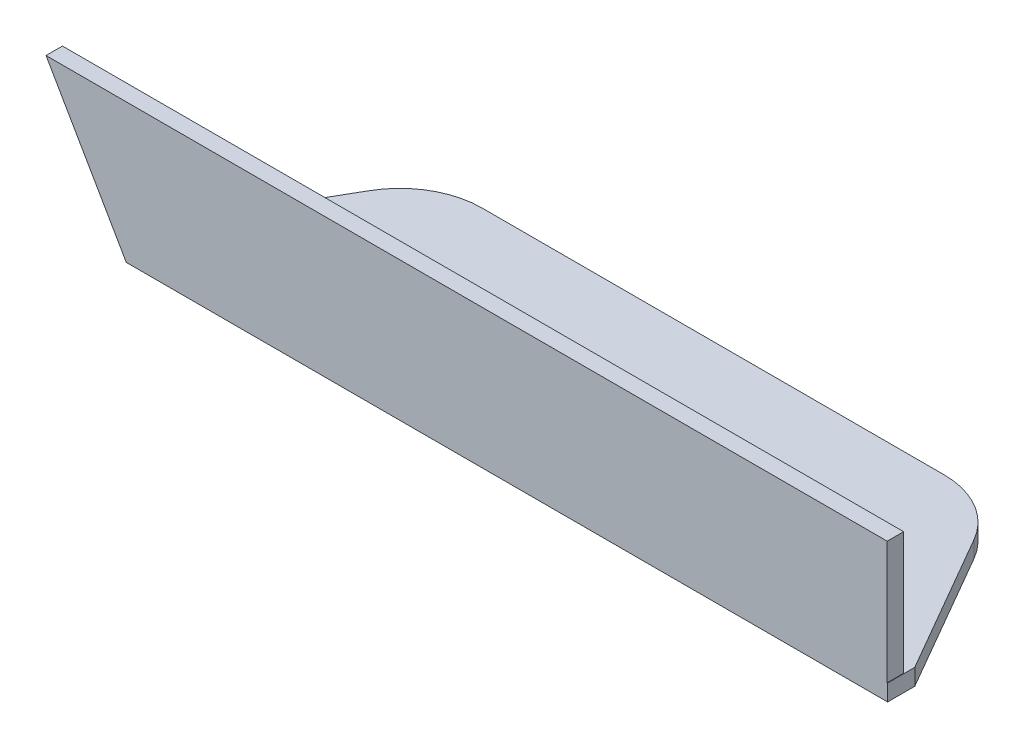
ISO-10303-21;
HEADER;
FILE_DESCRIPTION(('STEP AP214'),'2;1');
FILE_NAME('part.step','',(''),(''),'','','');
FILE_SCHEMA(('AUTOMOTIVE_DESIGN { 1 0 10303 214 1 1 1 1 }'));
ENDSEC;
DATA;
#1=APPLICATION_CONTEXT('core data for automotive mechanical design processes');
#2=APPLICATION_PROTOCOL_DEFINITION('international standard','automotive_design',2000,#1);
#3=PRODUCT_CONTEXT('',#1,'mechanical');
#4=PRODUCT('Part','Part','',(#3));
#5=PRODUCT_RELATED_PRODUCT_CATEGORY('part','',(#4));
#6=PRODUCT_DEFINITION_FORMATION('','',#4);
#7=PRODUCT_DEFINITION_CONTEXT('part definition',#1,'design');
#8=PRODUCT_DEFINITION('design','',#6,#7);
#9=PRODUCT_DEFINITION_SHAPE('','',#8);
#10=(LENGTH_UNIT() NAMED_UNIT(*) SI_UNIT(.MILLI.,.METRE.));
#11=(NAMED_UNIT(*) PLANE_ANGLE_UNIT() SI_UNIT($,.RADIAN.));
#12=(NAMED_UNIT(*) SI_UNIT($,.STERADIAN.) SOLID_ANGLE_UNIT());
#13=UNCERTAINTY_MEASURE_WITH_UNIT(LENGTH_MEASURE(1.E-05),#10,'distance_accuracy_value','');
#14=(GEOMETRIC_REPRESENTATION_CONTEXT(3) GLOBAL_UNCERTAINTY_ASSIGNED_CONTEXT((#13)) GLOBAL_UNIT_ASSIGNED_CONTEXT((#10,
#11,#12)) REPRESENTATION_CONTEXT('',''));
#15=CARTESIAN_POINT('',(0.,0.,0.));
#16=DIRECTION('',(0.,0.,1.));
#17=DIRECTION('',(1.,0.,0.));
#18=AXIS2_PLACEMENT_3D('',#15,#16,#17);
#19=CARTESIAN_POINT('',(-0.403411844343601,23.5,-50.));
#20=DIRECTION('',(0.,0.,1.));
#21=DIRECTION('',(1.,0.,0.));
#22=AXIS2_PLACEMENT_3D('',#19,#20,#21);
#23=PLANE('',#22);
#24=DIRECTION('',(0.,-1.,0.));
#25=VECTOR('',#24,1.);
#26=CARTESIAN_POINT('',(70.,25.,-50.));
#27=LINE('',#26,#25);
#28=CARTESIAN_POINT('',(70.,25.,-50.));
#29=VERTEX_POINT('',#28);
#30=CARTESIAN_POINT('',(70.,22.,-50.));
#31=VERTEX_POINT('',#30);
#32=EDGE_CURVE('E11',#29,#31,#27,.T.);
#33=ORIENTED_EDGE('',*,*,#32,.F.);
#34=DIRECTION('',(-1.,0.,0.));
#35=VECTOR('',#34,1.);
#36=CARTESIAN_POINT('',(70.,25.,-50.));
#37=LINE('',#36,#35);
#38=CARTESIAN_POINT('',(69.9238420958906,25.,-50.));
#39=VERTEX_POINT('',#38);
#40=EDGE_CURVE('E196',#29,#39,#37,.T.);
#41=ORIENTED_EDGE('',*,*,#40,.T.);
#42=DIRECTION('',(0.,1.,0.));
#43=VECTOR('',#42,1.);
#44=CARTESIAN_POINT('',(69.9238420958906,25.,-50.));
#45=LINE('',#44,#43);
#46=CARTESIAN_POINT('',(69.9238420958906,47.4,-50.));
#47=VERTEX_POINT('',#46);
#48=EDGE_CURVE('E241',#39,#47,#45,.T.);
#49=ORIENTED_EDGE('',*,*,#48,.T.);
#50=DIRECTION('',(-1.,0.,0.));
#51=VECTOR('',#50,1.);
#52=CARTESIAN_POINT('',(-70.8068236886871,47.4,-50.));
#53=LINE('',#52,#51);
#54=CARTESIAN_POINT('',(-83.7394697185345,47.4,-50.));
#55=VERTEX_POINT('',#54);
#56=EDGE_CURVE('E206',#47,#55,#53,.T.);
#57=ORIENTED_EDGE('',*,*,#56,.T.);
#58=DIRECTION('',(-0.499999999999993,0.866025403784443,0.));
#59=VECTOR('',#58,1.);
#60=CARTESIAN_POINT('',(-83.7394697185345,47.4,-50.));
#61=LINE('',#60,#59);
#62=CARTESIAN_POINT('',(-69.0747728811182,22.,-50.));
#63=VERTEX_POINT('',#62);
#64=EDGE_CURVE('E170',#63,#55,#61,.T.);
#65=ORIENTED_EDGE('',*,*,#64,.F.);
#66=DIRECTION('',(-1.,0.,0.));
#67=VECTOR('',#66,1.);
#68=CARTESIAN_POINT('',(70.,22.,-50.));
#69=LINE('',#68,#67);
#70=EDGE_CURVE('E58',#31,#63,#69,.T.);
#71=ORIENTED_EDGE('',*,*,#70,.F.);
#72=EDGE_LOOP('',(#33,#41,#49,#57,#65,#71));
#73=FACE_BOUND('',#72,.T.);
#74=ADVANCED_FACE('F47',(#73),#23,.T.);
#75=CARTESIAN_POINT('',(-0.403411844343601,23.5,-88.1));
#76=DIRECTION('',(0.,0.,1.));
#77=DIRECTION('',(1.,0.,0.));
#78=AXIS2_PLACEMENT_3D('',#75,#76,#77);
#79=PLANE('',#78);
#80=DIRECTION('',(0.,1.,0.));
#81=VECTOR('',#80,1.);
#82=CARTESIAN_POINT('',(-42.2043046777616,25.,-88.1));
#83=LINE('',#82,#81);
#84=CARTESIAN_POINT('',(-42.2043046777616,22.,-88.1));
#85=VERTEX_POINT('',#84);
#86=CARTESIAN_POINT('',(-42.2043046777616,25.,-88.1));
#87=VERTEX_POINT('',#86);
#88=EDGE_CURVE('E234',#85,#87,#83,.T.);
#89=ORIENTED_EDGE('',*,*,#88,.T.);
#90=DIRECTION('',(-1.,0.,0.));
#91=VECTOR('',#90,1.);
#92=CARTESIAN_POINT('',(70.,25.,-88.1));
#93=LINE('',#92,#91);
#94=CARTESIAN_POINT('',(42.2043046777617,25.,-88.1));
#95=VERTEX_POINT('',#94);
#96=EDGE_CURVE('E216',#95,#87,#93,.T.);
#97=ORIENTED_EDGE('',*,*,#96,.F.);
#98=DIRECTION('',(0.,1.,0.));
#99=VECTOR('',#98,1.);
#100=CARTESIAN_POINT('',(42.2043046777616,25.,-88.1));
#101=LINE('',#100,#99);
#102=CARTESIAN_POINT('',(42.2043046777617,22.,-88.1));
#103=VERTEX_POINT('',#102);
#104=EDGE_CURVE('E226',#103,#95,#101,.T.);
#105=ORIENTED_EDGE('',*,*,#104,.F.);
#106=DIRECTION('',(1.,0.,0.));
#107=VECTOR('',#106,1.);
#108=CARTESIAN_POINT('',(70.,22.,-88.1));
#109=LINE('',#108,#107);
#110=EDGE_CURVE('E209',#85,#103,#109,.T.);
#111=ORIENTED_EDGE('',*,*,#110,.F.);
#112=EDGE_LOOP('',(#89,#97,#105,#111));
#113=FACE_BOUND('',#112,.T.);
#114=ADVANCED_FACE('F312',(#113),#79,.F.);
#115=CARTESIAN_POINT('',(70.,22.,-50.));
#116=DIRECTION('',(-1.,0.,0.));
#117=DIRECTION('',(0.,0.,1.));
#118=AXIS2_PLACEMENT_3D('',#115,#116,#117);
#119=PLANE('',#118);
#120=DIRECTION('',(0.,1.,0.));
#121=VECTOR('',#120,1.);
#122=CARTESIAN_POINT('',(70.,23.5,-54.9564434701788));
#123=LINE('',#122,#121);
#124=CARTESIAN_POINT('',(70.,22.,-54.9564434701788));
#125=VERTEX_POINT('',#124);
#126=CARTESIAN_POINT('',(70.,25.,-54.9564434701788));
#127=VERTEX_POINT('',#126);
#128=EDGE_CURVE('E201',#125,#127,#123,.T.);
#129=ORIENTED_EDGE('',*,*,#128,.T.);
#130=DIRECTION('',(0.,0.,-1.));
#131=VECTOR('',#130,1.);
#132=CARTESIAN_POINT('',(70.,25.,-50.));
#133=LINE('',#132,#131);
#134=EDGE_CURVE('E219',#29,#127,#133,.T.);
#135=ORIENTED_EDGE('',*,*,#134,.F.);
#136=ORIENTED_EDGE('',*,*,#32,.T.);
#137=DIRECTION('',(0.,0.,-1.));
#138=VECTOR('',#137,1.);
#139=CARTESIAN_POINT('',(70.,22.,-50.));
#140=LINE('',#139,#138);
#141=EDGE_CURVE('E230',#31,#125,#140,.T.);
#142=ORIENTED_EDGE('',*,*,#141,.T.);
#143=EDGE_LOOP('',(#129,#135,#136,#142));
#144=FACE_BOUND('',#143,.T.);
#145=ADVANCED_FACE('F282',(#144),#119,.F.);
#146=CARTESIAN_POINT('',(-69.0747728811182,22.,-50.));
#147=DIRECTION('',(0.,1.,0.));
#148=DIRECTION('',(1.,0.,0.));
#149=AXIS2_PLACEMENT_3D('',#146,#147,#148);
#150=PLANE('',#149);
#151=CARTESIAN_POINT('',(-42.2043046777616,22.,-73.1));
#152=DIRECTION('',(0.,-1.,0.));
#153=DIRECTION('',(0.,0.,-1.));
#154=AXIS2_PLACEMENT_3D('',#151,#152,#153);
#155=CIRCLE('',#154,15.);
#156=CARTESIAN_POINT('',(-55.1946857345283,22.,-80.6));
#157=VERTEX_POINT('',#156);
#158=EDGE_CURVE('E238',#157,#85,#155,.T.);
#159=ORIENTED_EDGE('',*,*,#158,.T.);
#160=ORIENTED_EDGE('',*,*,#110,.T.);
#161=CARTESIAN_POINT('',(42.2043046777616,22.,-73.1));
#162=DIRECTION('',(0.,-1.,0.));
#163=DIRECTION('',(0.866025403784438,0.,-0.5));
#164=AXIS2_PLACEMENT_3D('',#161,#162,#163);
#165=CIRCLE('',#164,15.);
#166=CARTESIAN_POINT('',(55.1946857345283,22.,-80.6));
#167=VERTEX_POINT('',#166);
#168=EDGE_CURVE('E222',#103,#167,#165,.T.);
#169=ORIENTED_EDGE('',*,*,#168,.T.);
#170=DIRECTION('',(0.5,0.,0.866025403784439));
#171=VECTOR('',#170,1.);
#172=CARTESIAN_POINT('',(53.6887548792593,22.,-83.2083487540117));
#173=LINE('',#172,#171);
#174=EDGE_CURVE('E171',#167,#125,#173,.T.);
#175=ORIENTED_EDGE('',*,*,#174,.T.);
#176=ORIENTED_EDGE('',*,*,#141,.F.);
#177=ORIENTED_EDGE('',*,*,#70,.T.);
#178=DIRECTION('',(0.,0.,-1.));
#179=VECTOR('',#178,1.);
#180=CARTESIAN_POINT('',(-69.0747728811182,22.,-50.));
#181=LINE('',#180,#179);
#182=CARTESIAN_POINT('',(-69.0747728811182,22.,-56.5589838486226));
#183=VERTEX_POINT('',#182);
#184=EDGE_CURVE('E158',#63,#183,#181,.T.);
#185=ORIENTED_EDGE('',*,*,#184,.T.);
#186=DIRECTION('',(0.5,0.,-0.866025403784439));
#187=VECTOR('',#186,1.);
#188=CARTESIAN_POINT('',(-63.554790966803,22.,-66.1198729810779));
#189=LINE('',#188,#187);
#190=EDGE_CURVE('E162',#183,#157,#189,.T.);
#191=ORIENTED_EDGE('',*,*,#190,.T.);
#192=EDGE_LOOP('',(#159,#160,#169,#175,#176,#177,#185,#191));
#193=FACE_BOUND('',#192,.T.);
#194=ADVANCED_FACE('F161',(#193),#150,.F.);
#195=CARTESIAN_POINT('',(-0.4414907963982,47.4,-51.5));
#196=DIRECTION('',(0.,-1.,0.));
#197=DIRECTION('',(0.,0.,-1.));
#198=AXIS2_PLACEMENT_3D('',#195,#196,#197);
#199=PLANE('',#198);
#200=DIRECTION('',(-1.,0.,0.));
#201=VECTOR('',#200,1.);
#202=CARTESIAN_POINT('',(-70.8068236886871,47.4,-53.));
#203=LINE('',#202,#201);
#204=CARTESIAN_POINT('',(69.9238420958906,47.4,-53.));
#205=VERTEX_POINT('',#204);
#206=CARTESIAN_POINT('',(-83.7394697185345,47.4,-53.));
#207=VERTEX_POINT('',#206);
#208=EDGE_CURVE('E210',#205,#207,#203,.T.);
#209=ORIENTED_EDGE('',*,*,#208,.T.);
#210=DIRECTION('',(0.,0.,1.));
#211=VECTOR('',#210,1.);
#212=CARTESIAN_POINT('',(-83.7394697185345,47.4,-53.));
#213=LINE('',#212,#211);
#214=EDGE_CURVE('E233',#207,#55,#213,.T.);
#215=ORIENTED_EDGE('',*,*,#214,.T.);
#216=ORIENTED_EDGE('',*,*,#56,.F.);
#217=DIRECTION('',(0.,0.,1.));
#218=VECTOR('',#217,1.);
#219=CARTESIAN_POINT('',(69.9238420958906,47.4,-50.));
#220=LINE('',#219,#218);
#221=EDGE_CURVE('E215',#205,#47,#220,.T.);
#222=ORIENTED_EDGE('',*,*,#221,.F.);
#223=EDGE_LOOP('',(#209,#215,#216,#222));
#224=FACE_BOUND('',#223,.T.);
#225=ADVANCED_FACE('F298',(#224),#199,.F.);
#226=CARTESIAN_POINT('',(-70.8068236886871,25.,-53.));
#227=DIRECTION('',(0.,0.,1.));
#228=DIRECTION('',(1.,0.,0.));
#229=AXIS2_PLACEMENT_3D('',#226,#227,#228);
#230=PLANE('',#229);
#231=DIRECTION('',(-1.,0.,0.));
#232=VECTOR('',#231,1.);
#233=CARTESIAN_POINT('',(-0.403411844343601,25.,-53.));
#234=LINE('',#233,#232);
#235=CARTESIAN_POINT('',(69.9238420958906,25.,-53.));
#236=VERTEX_POINT('',#235);
#237=CARTESIAN_POINT('',(-70.8068236886871,25.,-53.));
#238=VERTEX_POINT('',#237);
#239=EDGE_CURVE('E197',#236,#238,#234,.T.);
#240=ORIENTED_EDGE('',*,*,#239,.T.);
#241=DIRECTION('',(0.499999999999993,-0.866025403784443,0.));
#242=VECTOR('',#241,1.);
#243=CARTESIAN_POINT('',(-83.7394697185345,47.4,-53.));
#244=LINE('',#243,#242);
#245=EDGE_CURVE('E200',#207,#238,#244,.T.);
#246=ORIENTED_EDGE('',*,*,#245,.F.);
#247=ORIENTED_EDGE('',*,*,#208,.F.);
#248=DIRECTION('',(0.,1.,0.));
#249=VECTOR('',#248,1.);
#250=CARTESIAN_POINT('',(69.9238420958906,25.,-53.));
#251=LINE('',#250,#249);
#252=EDGE_CURVE('E211',#236,#205,#251,.T.);
#253=ORIENTED_EDGE('',*,*,#252,.F.);
#254=EDGE_LOOP('',(#240,#246,#247,#253));
#255=FACE_BOUND('',#254,.T.);
#256=ADVANCED_FACE('F301',(#255),#230,.F.);
#257=CARTESIAN_POINT('',(69.9238420958906,25.,-53.));
#258=DIRECTION('',(-1.,0.,0.));
#259=DIRECTION('',(0.,0.,1.));
#260=AXIS2_PLACEMENT_3D('',#257,#258,#259);
#261=PLANE('',#260);
#262=DIRECTION('',(0.,0.,-1.));
#263=VECTOR('',#262,1.);
#264=CARTESIAN_POINT('',(69.9238420958906,25.,-51.5));
#265=LINE('',#264,#263);
#266=EDGE_CURVE('E192',#39,#236,#265,.T.);
#267=ORIENTED_EDGE('',*,*,#266,.T.);
#268=ORIENTED_EDGE('',*,*,#252,.T.);
#269=ORIENTED_EDGE('',*,*,#221,.T.);
#270=ORIENTED_EDGE('',*,*,#48,.F.);
#271=EDGE_LOOP('',(#267,#268,#269,#270));
#272=FACE_BOUND('',#271,.T.);
#273=ADVANCED_FACE('F49',(#272),#261,.F.);
#274=CARTESIAN_POINT('',(70.,25.,-50.));
#275=DIRECTION('',(0.,-1.,0.));
#276=DIRECTION('',(-1.,0.,0.));
#277=AXIS2_PLACEMENT_3D('',#274,#275,#276);
#278=PLANE('',#277);
#279=CARTESIAN_POINT('',(-42.2043046777616,25.,-73.1));
#280=DIRECTION('',(0.,1.,0.));
#281=DIRECTION('',(0.,0.,-1.));
#282=AXIS2_PLACEMENT_3D('',#279,#280,#281);
#283=CIRCLE('',#282,15.);
#284=CARTESIAN_POINT('',(-55.1946857345283,25.,-80.6));
#285=VERTEX_POINT('',#284);
#286=EDGE_CURVE('E51',#87,#285,#283,.T.);
#287=ORIENTED_EDGE('',*,*,#286,.T.);
#288=DIRECTION('',(-0.5,0.,0.866025403784439));
#289=VECTOR('',#288,1.);
#290=CARTESIAN_POINT('',(-46.1704443566632,25.,-96.230444566228));
#291=LINE('',#290,#289);
#292=CARTESIAN_POINT('',(-70.8068236886871,25.,-53.5589838486226));
#293=VERTEX_POINT('',#292);
#294=EDGE_CURVE('E185',#285,#293,#291,.T.);
#295=ORIENTED_EDGE('',*,*,#294,.T.);
#296=DIRECTION('',(0.,0.,-1.));
#297=VECTOR('',#296,1.);
#298=CARTESIAN_POINT('',(-70.8068236886871,25.,-50.));
#299=LINE('',#298,#297);
#300=EDGE_CURVE('E183',#238,#293,#299,.T.);
#301=ORIENTED_EDGE('',*,*,#300,.F.);
#302=ORIENTED_EDGE('',*,*,#239,.F.);
#303=ORIENTED_EDGE('',*,*,#266,.F.);
#304=ORIENTED_EDGE('',*,*,#40,.F.);
#305=ORIENTED_EDGE('',*,*,#134,.T.);
#306=DIRECTION('',(-0.5,0.,-0.866025403784439));
#307=VECTOR('',#306,1.);
#308=CARTESIAN_POINT('',(71.0731014893991,25.,-53.0977771688618));
#309=LINE('',#308,#307);
#310=CARTESIAN_POINT('',(55.1946857345283,25.,-80.6));
#311=VERTEX_POINT('',#310);
#312=EDGE_CURVE('E205',#127,#311,#309,.T.);
#313=ORIENTED_EDGE('',*,*,#312,.T.);
#314=CARTESIAN_POINT('',(42.2043046777616,25.,-73.1));
#315=DIRECTION('',(0.,1.,0.));
#316=DIRECTION('',(0.866025403784438,0.,-0.5));
#317=AXIS2_PLACEMENT_3D('',#314,#315,#316);
#318=CIRCLE('',#317,15.);
#319=EDGE_CURVE('E259',#311,#95,#318,.T.);
#320=ORIENTED_EDGE('',*,*,#319,.T.);
#321=ORIENTED_EDGE('',*,*,#96,.T.);
#322=EDGE_LOOP('',(#287,#295,#301,#302,#303,#304,#305,#313,#320,#321));
#323=FACE_BOUND('',#322,.T.);
#324=ADVANCED_FACE('F290',(#323),#278,.F.);
#325=CARTESIAN_POINT('',(-70.8068236886871,25.,-50.));
#326=DIRECTION('',(0.866025403784443,0.499999999999992,0.));
#327=DIRECTION('',(0.,0.,-1.));
#328=AXIS2_PLACEMENT_3D('',#325,#326,#327);
#329=PLANE('',#328);
#330=DIRECTION('',(0.377964473009224,-0.654653670707985,-0.654653670707971));
#331=VECTOR('',#330,1.);
#332=CARTESIAN_POINT('',(-66.786522905294,18.0366347814541,-60.5223490671684));
#333=LINE('',#332,#331);
#334=EDGE_CURVE('E176',#293,#183,#333,.T.);
#335=ORIENTED_EDGE('',*,*,#334,.T.);
#336=ORIENTED_EDGE('',*,*,#184,.F.);
#337=ORIENTED_EDGE('',*,*,#64,.T.);
#338=ORIENTED_EDGE('',*,*,#214,.F.);
#339=ORIENTED_EDGE('',*,*,#245,.T.);
#340=ORIENTED_EDGE('',*,*,#300,.T.);
#341=EDGE_LOOP('',(#335,#336,#337,#338,#339,#340));
#342=FACE_BOUND('',#341,.T.);
#343=ADVANCED_FACE('F180',(#342),#329,.F.);
#344=CARTESIAN_POINT('',(70.,25.,-54.9564434701788));
#345=DIRECTION('',(-0.866025403784439,0.,0.5));
#346=DIRECTION('',(0.,1.,0.));
#347=AXIS2_PLACEMENT_3D('',#344,#345,#346);
#348=PLANE('',#347);
#349=ORIENTED_EDGE('',*,*,#312,.F.);
#350=ORIENTED_EDGE('',*,*,#128,.F.);
#351=ORIENTED_EDGE('',*,*,#174,.F.);
#352=DIRECTION('',(0.,-1.,0.));
#353=VECTOR('',#352,1.);
#354=CARTESIAN_POINT('',(55.1946857345283,25.,-80.6));
#355=LINE('',#354,#353);
#356=EDGE_CURVE('E227',#311,#167,#355,.T.);
#357=ORIENTED_EDGE('',*,*,#356,.F.);
#358=EDGE_LOOP('',(#349,#350,#351,#357));
#359=FACE_BOUND('',#358,.T.);
#360=ADVANCED_FACE('F288',(#359),#348,.F.);
#361=CARTESIAN_POINT('',(42.2043046777616,25.,-73.1));
#362=DIRECTION('',(0.,-1.,0.));
#363=DIRECTION('',(0.866025403784438,0.,-0.5));
#364=AXIS2_PLACEMENT_3D('',#361,#362,#363);
#365=CYLINDRICAL_SURFACE('',#364,15.);
#366=ORIENTED_EDGE('',*,*,#319,.F.);
#367=ORIENTED_EDGE('',*,*,#356,.T.);
#368=ORIENTED_EDGE('',*,*,#168,.F.);
#369=ORIENTED_EDGE('',*,*,#104,.T.);
#370=EDGE_LOOP('',(#366,#367,#368,#369));
#371=FACE_BOUND('',#370,.T.);
#372=ADVANCED_FACE('F377',(#371),#365,.T.);
#373=CARTESIAN_POINT('',(-42.2043046777616,25.,-73.1));
#374=DIRECTION('',(0.,-1.,0.));
#375=DIRECTION('',(0.,0.,-1.));
#376=AXIS2_PLACEMENT_3D('',#373,#374,#375);
#377=CYLINDRICAL_SURFACE('',#376,15.);
#378=ORIENTED_EDGE('',*,*,#286,.F.);
#379=ORIENTED_EDGE('',*,*,#88,.F.);
#380=ORIENTED_EDGE('',*,*,#158,.F.);
#381=DIRECTION('',(0.,-1.,0.));
#382=VECTOR('',#381,1.);
#383=CARTESIAN_POINT('',(-55.1946857345283,25.,-80.6));
#384=LINE('',#383,#382);
#385=EDGE_CURVE('E177',#285,#157,#384,.T.);
#386=ORIENTED_EDGE('',*,*,#385,.F.);
#387=EDGE_LOOP('',(#378,#379,#380,#386));
#388=FACE_BOUND('',#387,.T.);
#389=ADVANCED_FACE('F387',(#388),#377,.T.);
#390=CARTESIAN_POINT('',(-55.1946857345283,25.,-80.6));
#391=DIRECTION('',(0.866025403784439,0.,0.5));
#392=DIRECTION('',(0.,-1.,0.));
#393=AXIS2_PLACEMENT_3D('',#390,#391,#392);
#394=PLANE('',#393);
#395=ORIENTED_EDGE('',*,*,#334,.F.);
#396=ORIENTED_EDGE('',*,*,#294,.F.);
#397=ORIENTED_EDGE('',*,*,#385,.T.);
#398=ORIENTED_EDGE('',*,*,#190,.F.);
#399=EDGE_LOOP('',(#395,#396,#397,#398));
#400=FACE_BOUND('',#399,.T.);
#401=ADVANCED_FACE('F174',(#400),#394,.F.);
#402=CLOSED_SHELL('',(#74,#114,#145,#194,#225,#256,#273,#324,#343,#360,#372,#389,#401));
#403=MANIFOLD_SOLID_BREP('B2',#402);
#404=ADVANCED_BREP_SHAPE_REPRESENTATION('',(#18,#403),#14);
#405=SHAPE_DEFINITION_REPRESENTATION(#9,#404);
ENDSEC;
END-ISO-10303-21;
